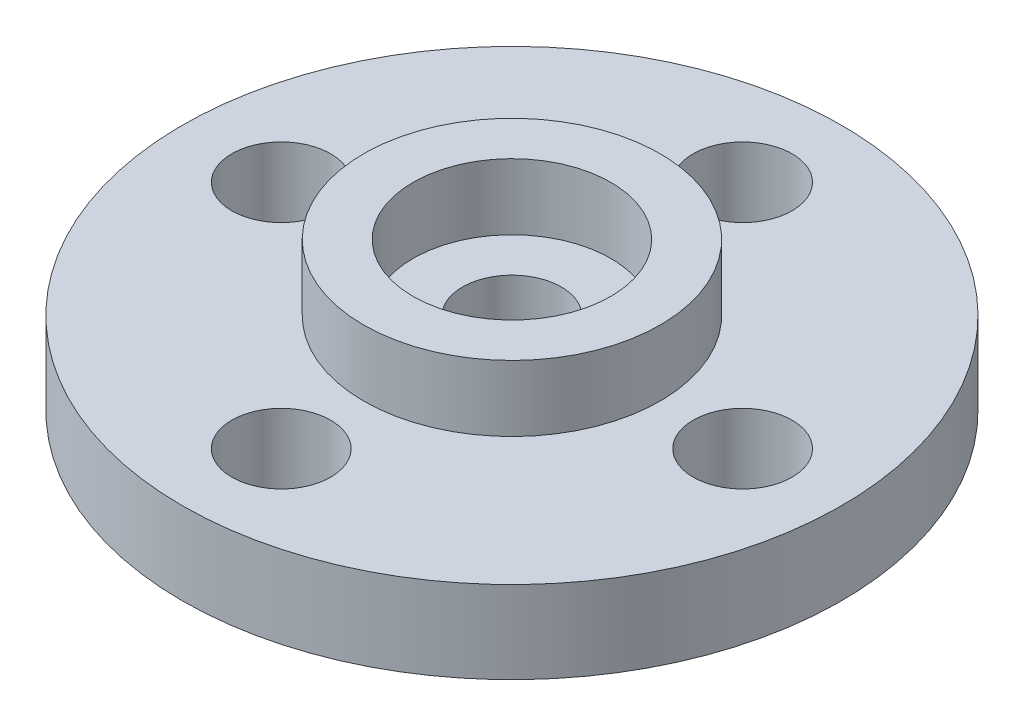
ISO-10303-21;
HEADER;
FILE_DESCRIPTION(('STEP AP214'),'2;1');
FILE_NAME('part.step','',(''),(''),'','','');
FILE_SCHEMA(('AUTOMOTIVE_DESIGN { 1 0 10303 214 1 1 1 1 }'));
ENDSEC;
DATA;
#1=APPLICATION_CONTEXT('core data for automotive mechanical design processes');
#2=APPLICATION_PROTOCOL_DEFINITION('international standard','automotive_design',2000,#1);
#3=PRODUCT_CONTEXT('',#1,'mechanical');
#4=PRODUCT('Part','Part','',(#3));
#5=PRODUCT_RELATED_PRODUCT_CATEGORY('part','',(#4));
#6=PRODUCT_DEFINITION_FORMATION('','',#4);
#7=PRODUCT_DEFINITION_CONTEXT('part definition',#1,'design');
#8=PRODUCT_DEFINITION('design','',#6,#7);
#9=PRODUCT_DEFINITION_SHAPE('','',#8);
#10=(LENGTH_UNIT() NAMED_UNIT(*) SI_UNIT(.MILLI.,.METRE.));
#11=(NAMED_UNIT(*) PLANE_ANGLE_UNIT() SI_UNIT($,.RADIAN.));
#12=(NAMED_UNIT(*) SI_UNIT($,.STERADIAN.) SOLID_ANGLE_UNIT());
#13=UNCERTAINTY_MEASURE_WITH_UNIT(LENGTH_MEASURE(1.E-05),#10,'distance_accuracy_value','');
#14=(GEOMETRIC_REPRESENTATION_CONTEXT(3) GLOBAL_UNCERTAINTY_ASSIGNED_CONTEXT((#13)) GLOBAL_UNIT_ASSIGNED_CONTEXT((#10,
#11,#12)) REPRESENTATION_CONTEXT('',''));
#15=CARTESIAN_POINT('',(0.,0.,0.));
#16=DIRECTION('',(0.,0.,1.));
#17=DIRECTION('',(1.,0.,0.));
#18=AXIS2_PLACEMENT_3D('',#15,#16,#17);
#19=CARTESIAN_POINT('',(0.,2.5,0.));
#20=DIRECTION('',(0.,-1.,0.));
#21=DIRECTION('',(0.,0.,-1.));
#22=AXIS2_PLACEMENT_3D('',#19,#20,#21);
#23=CYLINDRICAL_SURFACE('',#22,10.);
#24=CARTESIAN_POINT('',(0.,2.5,0.));
#25=DIRECTION('',(0.,1.,0.));
#26=DIRECTION('',(0.,0.,1.));
#27=AXIS2_PLACEMENT_3D('',#24,#25,#26);
#28=CIRCLE('',#27,10.);
#29=CARTESIAN_POINT('',(0.,2.5,10.));
#30=VERTEX_POINT('',#29);
#31=EDGE_CURVE('E10',#30,#30,#28,.T.);
#32=ORIENTED_EDGE('',*,*,#31,.F.);
#33=EDGE_LOOP('',(#32));
#34=FACE_BOUND('',#33,.T.);
#35=CARTESIAN_POINT('',(0.,0.,0.));
#36=DIRECTION('',(0.,1.,0.));
#37=DIRECTION('',(0.,0.,1.));
#38=AXIS2_PLACEMENT_3D('',#35,#36,#37);
#39=CIRCLE('',#38,10.);
#40=CARTESIAN_POINT('',(0.,0.,10.));
#41=VERTEX_POINT('',#40);
#42=EDGE_CURVE('E40',#41,#41,#39,.T.);
#43=ORIENTED_EDGE('',*,*,#42,.T.);
#44=EDGE_LOOP('',(#43));
#45=FACE_BOUND('',#44,.T.);
#46=ADVANCED_FACE('F37',(#34,#45),#23,.T.);
#47=CARTESIAN_POINT('',(0.,2.5,0.));
#48=DIRECTION('',(0.,1.,0.));
#49=DIRECTION('',(0.,0.,1.));
#50=AXIS2_PLACEMENT_3D('',#47,#48,#49);
#51=PLANE('',#50);
#52=CARTESIAN_POINT('',(0.,2.5,0.));
#53=DIRECTION('',(0.,1.,0.));
#54=DIRECTION('',(0.,0.,1.));
#55=AXIS2_PLACEMENT_3D('',#52,#53,#54);
#56=CIRCLE('',#55,4.5);
#57=CARTESIAN_POINT('',(0.,2.5,4.5));
#58=VERTEX_POINT('',#57);
#59=EDGE_CURVE('E83',#58,#58,#56,.T.);
#60=ORIENTED_EDGE('',*,*,#59,.F.);
#61=EDGE_LOOP('',(#60));
#62=FACE_BOUND('',#61,.T.);
#63=CARTESIAN_POINT('',(0.,2.5,-7.));
#64=DIRECTION('',(0.,1.,0.));
#65=DIRECTION('',(0.,0.,1.));
#66=AXIS2_PLACEMENT_3D('',#63,#64,#65);
#67=CIRCLE('',#66,1.5);
#68=CARTESIAN_POINT('',(0.,2.5,-5.5));
#69=VERTEX_POINT('',#68);
#70=EDGE_CURVE('E76',#69,#69,#67,.T.);
#71=ORIENTED_EDGE('',*,*,#70,.F.);
#72=EDGE_LOOP('',(#71));
#73=FACE_BOUND('',#72,.T.);
#74=CARTESIAN_POINT('',(7.0000000000002,2.5,-1.97666086873723E-13));
#75=DIRECTION('',(0.,1.,0.));
#76=DIRECTION('',(0.,0.,1.));
#77=AXIS2_PLACEMENT_3D('',#74,#75,#76);
#78=CIRCLE('',#77,1.50000000000015);
#79=CARTESIAN_POINT('',(7.0000000000002,2.5,1.49999999999996));
#80=VERTEX_POINT('',#79);
#81=EDGE_CURVE('E68',#80,#80,#78,.T.);
#82=ORIENTED_EDGE('',*,*,#81,.F.);
#83=EDGE_LOOP('',(#82));
#84=FACE_BOUND('',#83,.T.);
#85=CARTESIAN_POINT('',(3.95332173747447E-13,2.5,7.));
#86=DIRECTION('',(0.,1.,0.));
#87=DIRECTION('',(0.,0.,1.));
#88=AXIS2_PLACEMENT_3D('',#85,#86,#87);
#89=CIRCLE('',#88,1.50000000000042);
#90=CARTESIAN_POINT('',(3.95332173747447E-13,2.5,8.50000000000043));
#91=VERTEX_POINT('',#90);
#92=EDGE_CURVE('E60',#91,#91,#89,.T.);
#93=ORIENTED_EDGE('',*,*,#92,.F.);
#94=EDGE_LOOP('',(#93));
#95=FACE_BOUND('',#94,.T.);
#96=CARTESIAN_POINT('',(-6.9999999999998,2.5,1.98523339633126E-13));
#97=DIRECTION('',(0.,1.,0.));
#98=DIRECTION('',(0.,0.,1.));
#99=AXIS2_PLACEMENT_3D('',#96,#97,#98);
#100=CIRCLE('',#99,1.50000000000032);
#101=CARTESIAN_POINT('',(-6.9999999999998,2.5,1.50000000000052));
#102=VERTEX_POINT('',#101);
#103=EDGE_CURVE('E51',#102,#102,#100,.T.);
#104=ORIENTED_EDGE('',*,*,#103,.F.);
#105=EDGE_LOOP('',(#104));
#106=FACE_BOUND('',#105,.T.);
#107=ORIENTED_EDGE('',*,*,#31,.T.);
#108=EDGE_LOOP('',(#107));
#109=FACE_BOUND('',#108,.T.);
#110=ADVANCED_FACE('F141',(#62,#73,#84,#95,#106,#109),#51,.T.);
#111=CARTESIAN_POINT('',(0.,0.,0.));
#112=DIRECTION('',(0.,1.,0.));
#113=DIRECTION('',(0.,0.,1.));
#114=AXIS2_PLACEMENT_3D('',#111,#112,#113);
#115=PLANE('',#114);
#116=CARTESIAN_POINT('',(0.,0.,0.));
#117=DIRECTION('',(0.,1.,0.));
#118=DIRECTION('',(0.,0.,1.));
#119=AXIS2_PLACEMENT_3D('',#116,#117,#118);
#120=CIRCLE('',#119,1.5);
#121=CARTESIAN_POINT('',(0.,0.,1.5));
#122=VERTEX_POINT('',#121);
#123=EDGE_CURVE('E95',#122,#122,#120,.T.);
#124=ORIENTED_EDGE('',*,*,#123,.T.);
#125=EDGE_LOOP('',(#124));
#126=FACE_BOUND('',#125,.T.);
#127=CARTESIAN_POINT('',(0.,0.,-7.));
#128=DIRECTION('',(0.,1.,0.));
#129=DIRECTION('',(0.,0.,1.));
#130=AXIS2_PLACEMENT_3D('',#127,#128,#129);
#131=CIRCLE('',#130,1.5);
#132=CARTESIAN_POINT('',(0.,0.,-5.5));
#133=VERTEX_POINT('',#132);
#134=EDGE_CURVE('E49',#133,#133,#131,.T.);
#135=ORIENTED_EDGE('',*,*,#134,.T.);
#136=EDGE_LOOP('',(#135));
#137=FACE_BOUND('',#136,.T.);
#138=CARTESIAN_POINT('',(7.0000000000002,0.,-1.97666086873723E-13));
#139=DIRECTION('',(0.,1.,0.));
#140=DIRECTION('',(0.,0.,1.));
#141=AXIS2_PLACEMENT_3D('',#138,#139,#140);
#142=CIRCLE('',#141,1.50000000000015);
#143=CARTESIAN_POINT('',(7.0000000000002,0.,1.49999999999996));
#144=VERTEX_POINT('',#143);
#145=EDGE_CURVE('E72',#144,#144,#142,.T.);
#146=ORIENTED_EDGE('',*,*,#145,.T.);
#147=EDGE_LOOP('',(#146));
#148=FACE_BOUND('',#147,.T.);
#149=CARTESIAN_POINT('',(3.95332173747447E-13,0.,7.));
#150=DIRECTION('',(0.,1.,0.));
#151=DIRECTION('',(0.,0.,1.));
#152=AXIS2_PLACEMENT_3D('',#149,#150,#151);
#153=CIRCLE('',#152,1.50000000000042);
#154=CARTESIAN_POINT('',(3.95332173747447E-13,0.,8.50000000000043));
#155=VERTEX_POINT('',#154);
#156=EDGE_CURVE('E64',#155,#155,#153,.T.);
#157=ORIENTED_EDGE('',*,*,#156,.T.);
#158=EDGE_LOOP('',(#157));
#159=FACE_BOUND('',#158,.T.);
#160=CARTESIAN_POINT('',(-6.9999999999998,0.,1.98523339633126E-13));
#161=DIRECTION('',(0.,1.,0.));
#162=DIRECTION('',(0.,0.,1.));
#163=AXIS2_PLACEMENT_3D('',#160,#161,#162);
#164=CIRCLE('',#163,1.50000000000032);
#165=CARTESIAN_POINT('',(-6.9999999999998,0.,1.50000000000052));
#166=VERTEX_POINT('',#165);
#167=EDGE_CURVE('E55',#166,#166,#164,.T.);
#168=ORIENTED_EDGE('',*,*,#167,.T.);
#169=EDGE_LOOP('',(#168));
#170=FACE_BOUND('',#169,.T.);
#171=ORIENTED_EDGE('',*,*,#42,.F.);
#172=EDGE_LOOP('',(#171));
#173=FACE_BOUND('',#172,.T.);
#174=ADVANCED_FACE('F107',(#126,#137,#148,#159,#170,#173),#115,.F.);
#175=CARTESIAN_POINT('',(-6.9999999999998,0.,1.98523339633126E-13));
#176=DIRECTION('',(0.,1.,0.));
#177=DIRECTION('',(0.,0.,1.));
#178=AXIS2_PLACEMENT_3D('',#175,#176,#177);
#179=CYLINDRICAL_SURFACE('',#178,1.50000000000032);
#180=ORIENTED_EDGE('',*,*,#167,.F.);
#181=EDGE_LOOP('',(#180));
#182=FACE_BOUND('',#181,.T.);
#183=ORIENTED_EDGE('',*,*,#103,.T.);
#184=EDGE_LOOP('',(#183));
#185=FACE_BOUND('',#184,.T.);
#186=ADVANCED_FACE('F153',(#182,#185),#179,.F.);
#187=CARTESIAN_POINT('',(3.95332173747447E-13,0.,7.));
#188=DIRECTION('',(0.,1.,0.));
#189=DIRECTION('',(0.,0.,1.));
#190=AXIS2_PLACEMENT_3D('',#187,#188,#189);
#191=CYLINDRICAL_SURFACE('',#190,1.50000000000042);
#192=ORIENTED_EDGE('',*,*,#156,.F.);
#193=EDGE_LOOP('',(#192));
#194=FACE_BOUND('',#193,.T.);
#195=ORIENTED_EDGE('',*,*,#92,.T.);
#196=EDGE_LOOP('',(#195));
#197=FACE_BOUND('',#196,.T.);
#198=ADVANCED_FACE('F155',(#194,#197),#191,.F.);
#199=CARTESIAN_POINT('',(7.0000000000002,0.,-1.97666086873723E-13));
#200=DIRECTION('',(0.,1.,0.));
#201=DIRECTION('',(0.,0.,1.));
#202=AXIS2_PLACEMENT_3D('',#199,#200,#201);
#203=CYLINDRICAL_SURFACE('',#202,1.50000000000015);
#204=ORIENTED_EDGE('',*,*,#145,.F.);
#205=EDGE_LOOP('',(#204));
#206=FACE_BOUND('',#205,.T.);
#207=ORIENTED_EDGE('',*,*,#81,.T.);
#208=EDGE_LOOP('',(#207));
#209=FACE_BOUND('',#208,.T.);
#210=ADVANCED_FACE('F162',(#206,#209),#203,.F.);
#211=CARTESIAN_POINT('',(0.,0.,-7.));
#212=DIRECTION('',(0.,1.,0.));
#213=DIRECTION('',(0.,0.,1.));
#214=AXIS2_PLACEMENT_3D('',#211,#212,#213);
#215=CYLINDRICAL_SURFACE('',#214,1.5);
#216=ORIENTED_EDGE('',*,*,#134,.F.);
#217=EDGE_LOOP('',(#216));
#218=FACE_BOUND('',#217,.T.);
#219=ORIENTED_EDGE('',*,*,#70,.T.);
#220=EDGE_LOOP('',(#219));
#221=FACE_BOUND('',#220,.T.);
#222=ADVANCED_FACE('F137',(#218,#221),#215,.F.);
#223=CARTESIAN_POINT('',(0.,4.5,0.));
#224=DIRECTION('',(0.,-1.,0.));
#225=DIRECTION('',(0.,0.,-1.));
#226=AXIS2_PLACEMENT_3D('',#223,#224,#225);
#227=CYLINDRICAL_SURFACE('',#226,4.5);
#228=CARTESIAN_POINT('',(0.,4.5,0.));
#229=DIRECTION('',(0.,1.,0.));
#230=DIRECTION('',(0.,0.,1.));
#231=AXIS2_PLACEMENT_3D('',#228,#229,#230);
#232=CIRCLE('',#231,4.5);
#233=CARTESIAN_POINT('',(0.,4.5,4.5));
#234=VERTEX_POINT('',#233);
#235=EDGE_CURVE('E56',#234,#234,#232,.T.);
#236=ORIENTED_EDGE('',*,*,#235,.F.);
#237=EDGE_LOOP('',(#236));
#238=FACE_BOUND('',#237,.T.);
#239=ORIENTED_EDGE('',*,*,#59,.T.);
#240=EDGE_LOOP('',(#239));
#241=FACE_BOUND('',#240,.T.);
#242=ADVANCED_FACE('F131',(#238,#241),#227,.T.);
#243=CARTESIAN_POINT('',(0.,4.5,0.));
#244=DIRECTION('',(0.,1.,0.));
#245=DIRECTION('',(0.,0.,1.));
#246=AXIS2_PLACEMENT_3D('',#243,#244,#245);
#247=PLANE('',#246);
#248=CARTESIAN_POINT('',(0.,4.5,0.));
#249=DIRECTION('',(0.,1.,0.));
#250=DIRECTION('',(0.,0.,1.));
#251=AXIS2_PLACEMENT_3D('',#248,#249,#250);
#252=CIRCLE('',#251,3.);
#253=CARTESIAN_POINT('',(0.,4.5,3.));
#254=VERTEX_POINT('',#253);
#255=EDGE_CURVE('E91',#254,#254,#252,.T.);
#256=ORIENTED_EDGE('',*,*,#255,.F.);
#257=EDGE_LOOP('',(#256));
#258=FACE_BOUND('',#257,.T.);
#259=ORIENTED_EDGE('',*,*,#235,.T.);
#260=EDGE_LOOP('',(#259));
#261=FACE_BOUND('',#260,.T.);
#262=ADVANCED_FACE('F125',(#258,#261),#247,.T.);
#263=CARTESIAN_POINT('',(0.,2.5,0.));
#264=DIRECTION('',(0.,1.,0.));
#265=DIRECTION('',(0.,0.,1.));
#266=AXIS2_PLACEMENT_3D('',#263,#264,#265);
#267=CYLINDRICAL_SURFACE('',#266,3.);
#268=CARTESIAN_POINT('',(0.,2.5,0.));
#269=DIRECTION('',(0.,1.,0.));
#270=DIRECTION('',(0.,0.,1.));
#271=AXIS2_PLACEMENT_3D('',#268,#269,#270);
#272=CIRCLE('',#271,3.);
#273=CARTESIAN_POINT('',(0.,2.5,3.));
#274=VERTEX_POINT('',#273);
#275=EDGE_CURVE('E87',#274,#274,#272,.T.);
#276=ORIENTED_EDGE('',*,*,#275,.F.);
#277=EDGE_LOOP('',(#276));
#278=FACE_BOUND('',#277,.T.);
#279=ORIENTED_EDGE('',*,*,#255,.T.);
#280=EDGE_LOOP('',(#279));
#281=FACE_BOUND('',#280,.T.);
#282=ADVANCED_FACE('F119',(#278,#281),#267,.F.);
#283=CARTESIAN_POINT('',(0.,2.5,0.));
#284=DIRECTION('',(0.,1.,0.));
#285=DIRECTION('',(0.,0.,1.));
#286=AXIS2_PLACEMENT_3D('',#283,#284,#285);
#287=PLANE('',#286);
#288=CARTESIAN_POINT('',(0.,2.5,0.));
#289=DIRECTION('',(0.,1.,0.));
#290=DIRECTION('',(0.,0.,1.));
#291=AXIS2_PLACEMENT_3D('',#288,#289,#290);
#292=CIRCLE('',#291,1.5);
#293=CARTESIAN_POINT('',(0.,2.5,1.5));
#294=VERTEX_POINT('',#293);
#295=EDGE_CURVE('E99',#294,#294,#292,.T.);
#296=ORIENTED_EDGE('',*,*,#295,.F.);
#297=EDGE_LOOP('',(#296));
#298=FACE_BOUND('',#297,.T.);
#299=ORIENTED_EDGE('',*,*,#275,.T.);
#300=EDGE_LOOP('',(#299));
#301=FACE_BOUND('',#300,.T.);
#302=ADVANCED_FACE('F113',(#298,#301),#287,.T.);
#303=CARTESIAN_POINT('',(0.,0.,0.));
#304=DIRECTION('',(0.,1.,0.));
#305=DIRECTION('',(0.,0.,1.));
#306=AXIS2_PLACEMENT_3D('',#303,#304,#305);
#307=CYLINDRICAL_SURFACE('',#306,1.5);
#308=ORIENTED_EDGE('',*,*,#123,.F.);
#309=EDGE_LOOP('',(#308));
#310=FACE_BOUND('',#309,.T.);
#311=ORIENTED_EDGE('',*,*,#295,.T.);
#312=EDGE_LOOP('',(#311));
#313=FACE_BOUND('',#312,.T.);
#314=ADVANCED_FACE('F110',(#310,#313),#307,.F.);
#315=CLOSED_SHELL('',(#46,#110,#174,#186,#198,#210,#222,#242,#262,#282,#302,#314));
#316=MANIFOLD_SOLID_BREP('B2',#315);
#317=ADVANCED_BREP_SHAPE_REPRESENTATION('',(#18,#316),#14);
#318=SHAPE_DEFINITION_REPRESENTATION(#9,#317);
ENDSEC;
END-ISO-10303-21;
